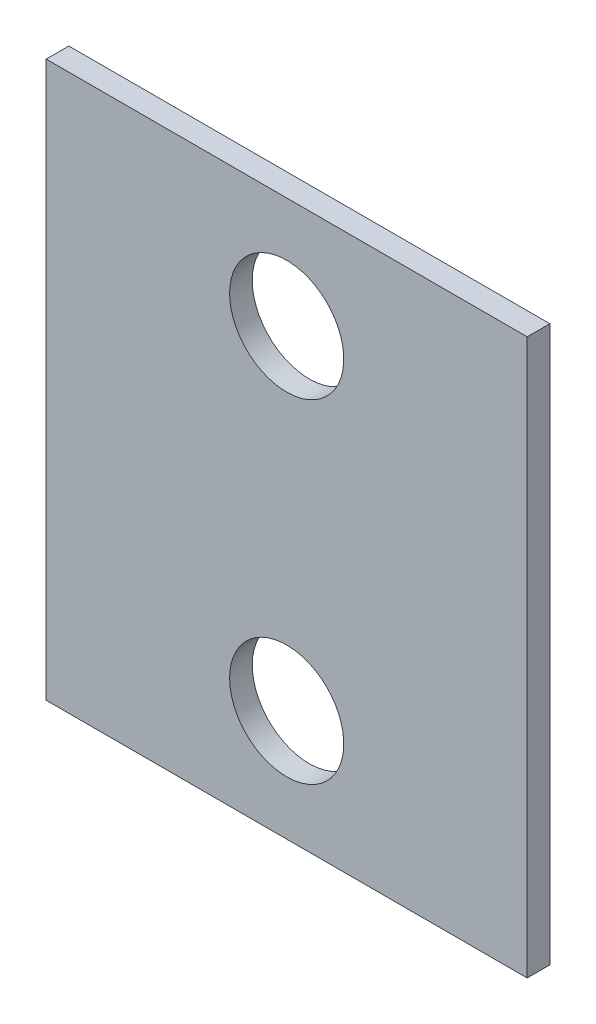
ISO-10303-21;
HEADER;
FILE_DESCRIPTION(('STEP AP214'),'2;1');
FILE_NAME('part.step','',(''),(''),'','','');
FILE_SCHEMA(('AUTOMOTIVE_DESIGN { 1 0 10303 214 1 1 1 1 }'));
ENDSEC;
DATA;
#1=APPLICATION_CONTEXT('core data for automotive mechanical design processes');
#2=APPLICATION_PROTOCOL_DEFINITION('international standard','automotive_design',2000,#1);
#3=PRODUCT_CONTEXT('',#1,'mechanical');
#4=PRODUCT('Part','Part','',(#3));
#5=PRODUCT_RELATED_PRODUCT_CATEGORY('part','',(#4));
#6=PRODUCT_DEFINITION_FORMATION('','',#4);
#7=PRODUCT_DEFINITION_CONTEXT('part definition',#1,'design');
#8=PRODUCT_DEFINITION('design','',#6,#7);
#9=PRODUCT_DEFINITION_SHAPE('','',#8);
#10=(LENGTH_UNIT() NAMED_UNIT(*) SI_UNIT(.MILLI.,.METRE.));
#11=(NAMED_UNIT(*) PLANE_ANGLE_UNIT() SI_UNIT($,.RADIAN.));
#12=(NAMED_UNIT(*) SI_UNIT($,.STERADIAN.) SOLID_ANGLE_UNIT());
#13=UNCERTAINTY_MEASURE_WITH_UNIT(LENGTH_MEASURE(1.E-05),#10,'distance_accuracy_value','');
#14=(GEOMETRIC_REPRESENTATION_CONTEXT(3) GLOBAL_UNCERTAINTY_ASSIGNED_CONTEXT((#13)) GLOBAL_UNIT_ASSIGNED_CONTEXT((#10,
#11,#12)) REPRESENTATION_CONTEXT('',''));
#15=CARTESIAN_POINT('',(0.,0.,0.));
#16=DIRECTION('',(0.,0.,1.));
#17=DIRECTION('',(1.,0.,0.));
#18=AXIS2_PLACEMENT_3D('',#15,#16,#17);
#19=CARTESIAN_POINT('',(-149.968364905673,0.,1814.8046));
#20=DIRECTION('',(0.,0.,-1.));
#21=DIRECTION('',(-1.,0.,0.));
#22=AXIS2_PLACEMENT_3D('',#19,#20,#21);
#23=PLANE('',#22);
#24=CARTESIAN_POINT('',(-140.865724971035,9.525,1814.8046));
#25=DIRECTION('',(0.,0.,-1.));
#26=DIRECTION('',(-1.,0.,0.));
#27=AXIS2_PLACEMENT_3D('',#24,#25,#26);
#28=CIRCLE('',#27,3.2639);
#29=CARTESIAN_POINT('',(-144.129624971035,9.525,1814.8046));
#30=VERTEX_POINT('',#29);
#31=EDGE_CURVE('E84',#30,#30,#28,.F.);
#32=ORIENTED_EDGE('',*,*,#31,.T.);
#33=EDGE_LOOP('',(#32));
#34=FACE_BOUND('',#33,.T.);
#35=CARTESIAN_POINT('',(-140.865724971035,-9.525,1814.8046));
#36=DIRECTION('',(0.,0.,-1.));
#37=DIRECTION('',(-1.,0.,0.));
#38=AXIS2_PLACEMENT_3D('',#35,#36,#37);
#39=CIRCLE('',#38,3.2639);
#40=CARTESIAN_POINT('',(-144.129624971035,-9.525,1814.8046));
#41=VERTEX_POINT('',#40);
#42=EDGE_CURVE('E20',#41,#41,#39,.F.);
#43=ORIENTED_EDGE('',*,*,#42,.T.);
#44=EDGE_LOOP('',(#43));
#45=FACE_BOUND('',#44,.T.);
#46=DIRECTION('',(1.,0.,0.));
#47=VECTOR('',#46,1.);
#48=CARTESIAN_POINT('',(-152.956932783135,-15.875,1814.8046));
#49=LINE('',#48,#47);
#50=CARTESIAN_POINT('',(-154.617284971035,-15.875,1814.8046));
#51=VERTEX_POINT('',#50);
#52=CARTESIAN_POINT('',(-127.114164971035,-15.875,1814.8046));
#53=VERTEX_POINT('',#52);
#54=EDGE_CURVE('E63',#51,#53,#49,.T.);
#55=ORIENTED_EDGE('',*,*,#54,.F.);
#56=DIRECTION('',(0.,1.,0.));
#57=VECTOR('',#56,1.);
#58=CARTESIAN_POINT('',(-154.617284971035,-1.75839247554533,1814.8046));
#59=LINE('',#58,#57);
#60=CARTESIAN_POINT('',(-154.617284971035,15.875,1814.8046));
#61=VERTEX_POINT('',#60);
#62=EDGE_CURVE('E59',#51,#61,#59,.T.);
#63=ORIENTED_EDGE('',*,*,#62,.T.);
#64=DIRECTION('',(1.,0.,0.));
#65=VECTOR('',#64,1.);
#66=CARTESIAN_POINT('',(-152.956932783135,15.875,1814.8046));
#67=LINE('',#66,#65);
#68=CARTESIAN_POINT('',(-127.114164971035,15.875,1814.8046));
#69=VERTEX_POINT('',#68);
#70=EDGE_CURVE('E61',#61,#69,#67,.T.);
#71=ORIENTED_EDGE('',*,*,#70,.T.);
#72=DIRECTION('',(0.,1.,0.));
#73=VECTOR('',#72,1.);
#74=CARTESIAN_POINT('',(-127.114164971035,-1.75839247554533,1814.8046));
#75=LINE('',#74,#73);
#76=EDGE_CURVE('E54',#53,#69,#75,.T.);
#77=ORIENTED_EDGE('',*,*,#76,.F.);
#78=EDGE_LOOP('',(#55,#63,#71,#77));
#79=FACE_BOUND('',#78,.T.);
#80=ADVANCED_FACE('F17',(#34,#45,#79),#23,.T.);
#81=CARTESIAN_POINT('',(-154.617284971035,-1.75839247554533,1814.8046));
#82=DIRECTION('',(1.,0.,0.));
#83=DIRECTION('',(0.,0.,-1.));
#84=AXIS2_PLACEMENT_3D('',#81,#82,#83);
#85=PLANE('',#84);
#86=ORIENTED_EDGE('',*,*,#62,.F.);
#87=DIRECTION('',(0.,0.,-1.));
#88=VECTOR('',#87,1.);
#89=CARTESIAN_POINT('',(-154.617284971035,-15.875,1814.8046));
#90=LINE('',#89,#88);
#91=CARTESIAN_POINT('',(-154.617284971035,-15.875,1816.1));
#92=VERTEX_POINT('',#91);
#93=EDGE_CURVE('E94',#92,#51,#90,.T.);
#94=ORIENTED_EDGE('',*,*,#93,.F.);
#95=DIRECTION('',(0.,1.,0.));
#96=VECTOR('',#95,1.);
#97=CARTESIAN_POINT('',(-154.617284971035,0.,1816.1));
#98=LINE('',#97,#96);
#99=CARTESIAN_POINT('',(-154.617284971035,15.875,1816.1));
#100=VERTEX_POINT('',#99);
#101=EDGE_CURVE('E78',#92,#100,#98,.T.);
#102=ORIENTED_EDGE('',*,*,#101,.T.);
#103=DIRECTION('',(0.,0.,-1.));
#104=VECTOR('',#103,1.);
#105=CARTESIAN_POINT('',(-154.617284971035,15.875,1814.8046));
#106=LINE('',#105,#104);
#107=EDGE_CURVE('E68',#100,#61,#106,.T.);
#108=ORIENTED_EDGE('',*,*,#107,.T.);
#109=EDGE_LOOP('',(#86,#94,#102,#108));
#110=FACE_BOUND('',#109,.T.);
#111=ADVANCED_FACE('F77',(#110),#85,.F.);
#112=CARTESIAN_POINT('',(-152.956932783135,15.875,1814.8046));
#113=DIRECTION('',(0.,-1.,0.));
#114=DIRECTION('',(0.,0.,-1.));
#115=AXIS2_PLACEMENT_3D('',#112,#113,#114);
#116=PLANE('',#115);
#117=ORIENTED_EDGE('',*,*,#70,.F.);
#118=ORIENTED_EDGE('',*,*,#107,.F.);
#119=DIRECTION('',(-1.,0.,0.));
#120=VECTOR('',#119,1.);
#121=CARTESIAN_POINT('',(-149.968364905673,15.875,1816.1));
#122=LINE('',#121,#120);
#123=CARTESIAN_POINT('',(-127.114164971035,15.875,1816.1));
#124=VERTEX_POINT('',#123);
#125=EDGE_CURVE('E88',#100,#124,#122,.F.);
#126=ORIENTED_EDGE('',*,*,#125,.T.);
#127=DIRECTION('',(0.,0.,-1.));
#128=VECTOR('',#127,1.);
#129=CARTESIAN_POINT('',(-127.114164971035,15.875,1814.8046));
#130=LINE('',#129,#128);
#131=EDGE_CURVE('E74',#69,#124,#130,.F.);
#132=ORIENTED_EDGE('',*,*,#131,.F.);
#133=EDGE_LOOP('',(#117,#118,#126,#132));
#134=FACE_BOUND('',#133,.T.);
#135=ADVANCED_FACE('F71',(#134),#116,.F.);
#136=CARTESIAN_POINT('',(-127.114164971035,-1.75839247554533,1814.8046));
#137=DIRECTION('',(1.,0.,0.));
#138=DIRECTION('',(0.,0.,-1.));
#139=AXIS2_PLACEMENT_3D('',#136,#137,#138);
#140=PLANE('',#139);
#141=ORIENTED_EDGE('',*,*,#131,.T.);
#142=DIRECTION('',(0.,1.,0.));
#143=VECTOR('',#142,1.);
#144=CARTESIAN_POINT('',(-127.114164971035,0.,1816.1));
#145=LINE('',#144,#143);
#146=CARTESIAN_POINT('',(-127.114164971035,-15.875,1816.1));
#147=VERTEX_POINT('',#146);
#148=EDGE_CURVE('E102',#124,#147,#145,.F.);
#149=ORIENTED_EDGE('',*,*,#148,.T.);
#150=DIRECTION('',(0.,0.,-1.));
#151=VECTOR('',#150,1.);
#152=CARTESIAN_POINT('',(-127.114164971035,-15.875,1814.8046));
#153=LINE('',#152,#151);
#154=EDGE_CURVE('E35',#53,#147,#153,.F.);
#155=ORIENTED_EDGE('',*,*,#154,.F.);
#156=ORIENTED_EDGE('',*,*,#76,.T.);
#157=EDGE_LOOP('',(#141,#149,#155,#156));
#158=FACE_BOUND('',#157,.T.);
#159=ADVANCED_FACE('F101',(#158),#140,.T.);
#160=CARTESIAN_POINT('',(-152.956932783135,-15.875,1814.8046));
#161=DIRECTION('',(0.,-1.,0.));
#162=DIRECTION('',(0.,0.,-1.));
#163=AXIS2_PLACEMENT_3D('',#160,#161,#162);
#164=PLANE('',#163);
#165=ORIENTED_EDGE('',*,*,#154,.T.);
#166=DIRECTION('',(-1.,0.,0.));
#167=VECTOR('',#166,1.);
#168=CARTESIAN_POINT('',(-149.968364905673,-15.875,1816.1));
#169=LINE('',#168,#167);
#170=EDGE_CURVE('E83',#147,#92,#169,.T.);
#171=ORIENTED_EDGE('',*,*,#170,.T.);
#172=ORIENTED_EDGE('',*,*,#93,.T.);
#173=ORIENTED_EDGE('',*,*,#54,.T.);
#174=EDGE_LOOP('',(#165,#171,#172,#173));
#175=FACE_BOUND('',#174,.T.);
#176=ADVANCED_FACE('F107',(#175),#164,.T.);
#177=CARTESIAN_POINT('',(-140.865724971035,-9.525,1814.8046));
#178=DIRECTION('',(0.,0.,-1.));
#179=DIRECTION('',(-1.,0.,0.));
#180=AXIS2_PLACEMENT_3D('',#177,#178,#179);
#181=CYLINDRICAL_SURFACE('',#180,3.2639);
#182=ORIENTED_EDGE('',*,*,#42,.F.);
#183=EDGE_LOOP('',(#182));
#184=FACE_BOUND('',#183,.T.);
#185=CARTESIAN_POINT('',(-140.865724971035,-9.525,1816.1));
#186=DIRECTION('',(0.,0.,-1.));
#187=DIRECTION('',(-1.,0.,0.));
#188=AXIS2_PLACEMENT_3D('',#185,#186,#187);
#189=CIRCLE('',#188,3.2639);
#190=CARTESIAN_POINT('',(-144.129624971035,-9.525,1816.1));
#191=VERTEX_POINT('',#190);
#192=EDGE_CURVE('E26',#191,#191,#189,.F.);
#193=ORIENTED_EDGE('',*,*,#192,.T.);
#194=EDGE_LOOP('',(#193));
#195=FACE_BOUND('',#194,.T.);
#196=ADVANCED_FACE('F109',(#184,#195),#181,.F.);
#197=CARTESIAN_POINT('',(-140.865724971035,9.525,1814.8046));
#198=DIRECTION('',(0.,0.,-1.));
#199=DIRECTION('',(-1.,0.,0.));
#200=AXIS2_PLACEMENT_3D('',#197,#198,#199);
#201=CYLINDRICAL_SURFACE('',#200,3.2639);
#202=ORIENTED_EDGE('',*,*,#31,.F.);
#203=EDGE_LOOP('',(#202));
#204=FACE_BOUND('',#203,.T.);
#205=CARTESIAN_POINT('',(-140.865724971035,9.525,1816.1));
#206=DIRECTION('',(0.,0.,-1.));
#207=DIRECTION('',(-1.,0.,0.));
#208=AXIS2_PLACEMENT_3D('',#205,#206,#207);
#209=CIRCLE('',#208,3.2639);
#210=CARTESIAN_POINT('',(-144.129624971035,9.525,1816.1));
#211=VERTEX_POINT('',#210);
#212=EDGE_CURVE('E11',#211,#211,#209,.F.);
#213=ORIENTED_EDGE('',*,*,#212,.T.);
#214=EDGE_LOOP('',(#213));
#215=FACE_BOUND('',#214,.T.);
#216=ADVANCED_FACE('F116',(#204,#215),#201,.F.);
#217=CARTESIAN_POINT('',(-149.968364905673,0.,1816.1));
#218=DIRECTION('',(0.,0.,-1.));
#219=DIRECTION('',(-1.,0.,0.));
#220=AXIS2_PLACEMENT_3D('',#217,#218,#219);
#221=PLANE('',#220);
#222=ORIENTED_EDGE('',*,*,#212,.F.);
#223=EDGE_LOOP('',(#222));
#224=FACE_BOUND('',#223,.T.);
#225=ORIENTED_EDGE('',*,*,#192,.F.);
#226=EDGE_LOOP('',(#225));
#227=FACE_BOUND('',#226,.T.);
#228=ORIENTED_EDGE('',*,*,#148,.F.);
#229=ORIENTED_EDGE('',*,*,#125,.F.);
#230=ORIENTED_EDGE('',*,*,#101,.F.);
#231=ORIENTED_EDGE('',*,*,#170,.F.);
#232=EDGE_LOOP('',(#228,#229,#230,#231));
#233=FACE_BOUND('',#232,.T.);
#234=ADVANCED_FACE('F104',(#224,#227,#233),#221,.F.);
#235=CLOSED_SHELL('',(#80,#111,#135,#159,#176,#196,#216,#234));
#236=MANIFOLD_SOLID_BREP('B1',#235);
#237=ADVANCED_BREP_SHAPE_REPRESENTATION('',(#18,#236),#14);
#238=SHAPE_DEFINITION_REPRESENTATION(#9,#237);
ENDSEC;
END-ISO-10303-21;
